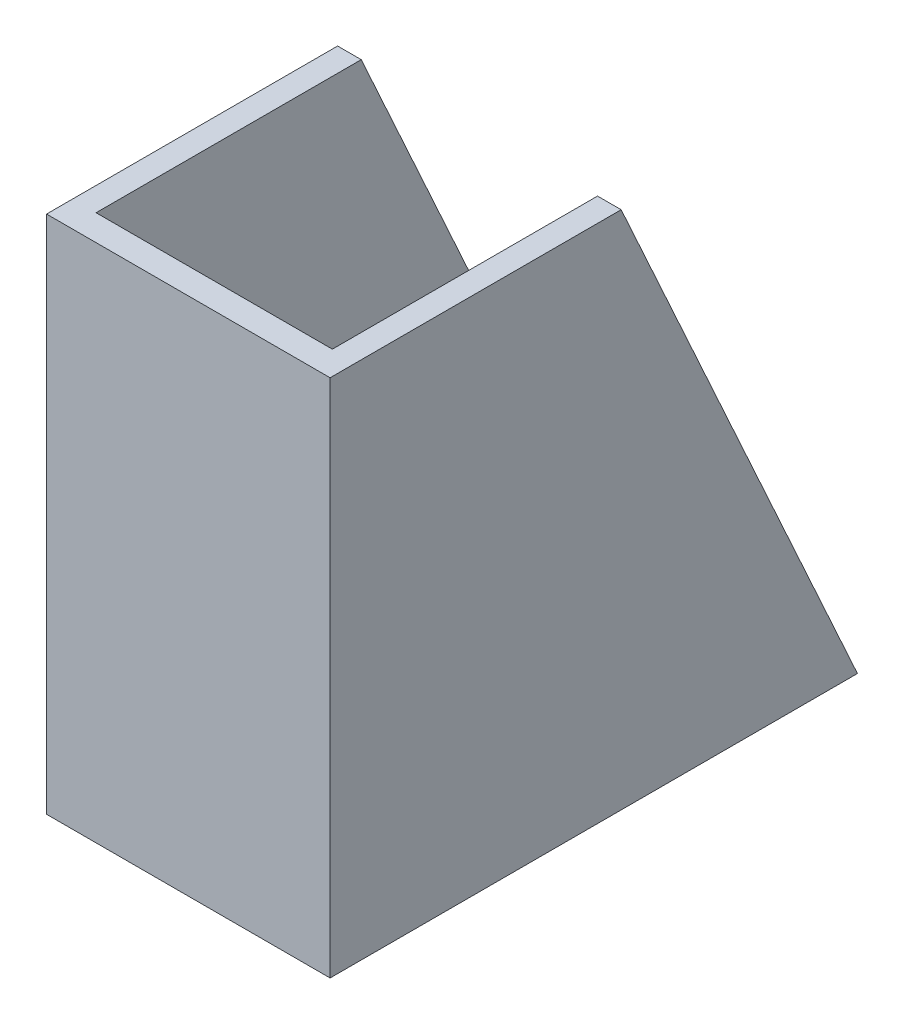
ISO-10303-21;
HEADER;
FILE_DESCRIPTION(('STEP AP214'),'2;1');
FILE_NAME('part.step','',(''),(''),'','','');
FILE_SCHEMA(('AUTOMOTIVE_DESIGN { 1 0 10303 214 1 1 1 1 }'));
ENDSEC;
DATA;
#1=APPLICATION_CONTEXT('core data for automotive mechanical design processes');
#2=APPLICATION_PROTOCOL_DEFINITION('international standard','automotive_design',2000,#1);
#3=PRODUCT_CONTEXT('',#1,'mechanical');
#4=PRODUCT('Part','Part','',(#3));
#5=PRODUCT_RELATED_PRODUCT_CATEGORY('part','',(#4));
#6=PRODUCT_DEFINITION_FORMATION('','',#4);
#7=PRODUCT_DEFINITION_CONTEXT('part definition',#1,'design');
#8=PRODUCT_DEFINITION('design','',#6,#7);
#9=PRODUCT_DEFINITION_SHAPE('','',#8);
#10=(LENGTH_UNIT() NAMED_UNIT(*) SI_UNIT(.MILLI.,.METRE.));
#11=(NAMED_UNIT(*) PLANE_ANGLE_UNIT() SI_UNIT($,.RADIAN.));
#12=(NAMED_UNIT(*) SI_UNIT($,.STERADIAN.) SOLID_ANGLE_UNIT());
#13=UNCERTAINTY_MEASURE_WITH_UNIT(LENGTH_MEASURE(1.E-05),#10,'distance_accuracy_value','');
#14=(GEOMETRIC_REPRESENTATION_CONTEXT(3) GLOBAL_UNCERTAINTY_ASSIGNED_CONTEXT((#13)) GLOBAL_UNIT_ASSIGNED_CONTEXT((#10,
#11,#12)) REPRESENTATION_CONTEXT('',''));
#15=CARTESIAN_POINT('',(0.,0.,0.));
#16=DIRECTION('',(0.,0.,1.));
#17=DIRECTION('',(1.,0.,0.));
#18=AXIS2_PLACEMENT_3D('',#15,#16,#17);
#19=CARTESIAN_POINT('',(-60.,76.2699156300782,30.795));
#20=DIRECTION('',(0.,0.,1.));
#21=DIRECTION('',(0.,-1.,0.));
#22=AXIS2_PLACEMENT_3D('',#19,#20,#21);
#23=PLANE('',#22);
#24=DIRECTION('',(0.,-1.,0.));
#25=VECTOR('',#24,1.);
#26=CARTESIAN_POINT('',(0.,76.2699156300782,30.795));
#27=LINE('',#26,#25);
#28=CARTESIAN_POINT('',(0.,76.2699156300782,30.795));
#29=VERTEX_POINT('',#28);
#30=CARTESIAN_POINT('',(0.,-33.7300843699218,30.795));
#31=VERTEX_POINT('',#30);
#32=EDGE_CURVE('E164',#29,#31,#27,.T.);
#33=ORIENTED_EDGE('',*,*,#32,.F.);
#34=DIRECTION('',(1.,0.,0.));
#35=VECTOR('',#34,1.);
#36=CARTESIAN_POINT('',(-60.,76.2699156300782,30.795));
#37=LINE('',#36,#35);
#38=CARTESIAN_POINT('',(-60.,76.2699156300782,30.795));
#39=VERTEX_POINT('',#38);
#40=EDGE_CURVE('E11',#39,#29,#37,.T.);
#41=ORIENTED_EDGE('',*,*,#40,.F.);
#42=DIRECTION('',(0.,-1.,0.));
#43=VECTOR('',#42,1.);
#44=CARTESIAN_POINT('',(-60.,76.2699156300782,30.795));
#45=LINE('',#44,#43);
#46=CARTESIAN_POINT('',(-60.,-33.7300843699218,30.795));
#47=VERTEX_POINT('',#46);
#48=EDGE_CURVE('E178',#39,#47,#45,.T.);
#49=ORIENTED_EDGE('',*,*,#48,.T.);
#50=DIRECTION('',(1.,0.,0.));
#51=VECTOR('',#50,1.);
#52=CARTESIAN_POINT('',(-60.,-33.7300843699218,30.795));
#53=LINE('',#52,#51);
#54=EDGE_CURVE('E42',#47,#31,#53,.T.);
#55=ORIENTED_EDGE('',*,*,#54,.T.);
#56=EDGE_LOOP('',(#33,#41,#49,#55));
#57=FACE_BOUND('',#56,.T.);
#58=ADVANCED_FACE('F39',(#57),#23,.T.);
#59=CARTESIAN_POINT('',(-60.,76.2699156300782,-30.795));
#60=DIRECTION('',(0.,1.,0.));
#61=DIRECTION('',(0.,0.,1.));
#62=AXIS2_PLACEMENT_3D('',#59,#60,#61);
#63=PLANE('',#62);
#64=DIRECTION('',(0.,0.,1.));
#65=VECTOR('',#64,1.);
#66=CARTESIAN_POINT('',(-5.,76.2699156300782,-30.795));
#67=LINE('',#66,#65);
#68=CARTESIAN_POINT('',(-5.,76.2699156300782,-30.795));
#69=VERTEX_POINT('',#68);
#70=CARTESIAN_POINT('',(-5.,76.2699156300782,25.315));
#71=VERTEX_POINT('',#70);
#72=EDGE_CURVE('E210',#69,#71,#67,.T.);
#73=ORIENTED_EDGE('',*,*,#72,.T.);
#74=DIRECTION('',(-1.,0.,0.));
#75=VECTOR('',#74,1.);
#76=CARTESIAN_POINT('',(-5.,76.2699156300782,25.315));
#77=LINE('',#76,#75);
#78=CARTESIAN_POINT('',(-55.,76.2699156300782,25.315));
#79=VERTEX_POINT('',#78);
#80=EDGE_CURVE('E138',#71,#79,#77,.T.);
#81=ORIENTED_EDGE('',*,*,#80,.T.);
#82=DIRECTION('',(0.,0.,1.));
#83=VECTOR('',#82,1.);
#84=CARTESIAN_POINT('',(-55.,76.2699156300782,-30.795));
#85=LINE('',#84,#83);
#86=CARTESIAN_POINT('',(-55.,76.2699156300782,-30.795));
#87=VERTEX_POINT('',#86);
#88=EDGE_CURVE('E128',#87,#79,#85,.T.);
#89=ORIENTED_EDGE('',*,*,#88,.F.);
#90=DIRECTION('',(1.,0.,0.));
#91=VECTOR('',#90,1.);
#92=CARTESIAN_POINT('',(-60.,76.2699156300782,-30.795));
#93=LINE('',#92,#91);
#94=CARTESIAN_POINT('',(-60.,76.2699156300782,-30.795));
#95=VERTEX_POINT('',#94);
#96=EDGE_CURVE('E48',#95,#87,#93,.T.);
#97=ORIENTED_EDGE('',*,*,#96,.F.);
#98=DIRECTION('',(0.,0.,1.));
#99=VECTOR('',#98,1.);
#100=CARTESIAN_POINT('',(-60.,76.2699156300782,-30.795));
#101=LINE('',#100,#99);
#102=EDGE_CURVE('E156',#95,#39,#101,.T.);
#103=ORIENTED_EDGE('',*,*,#102,.T.);
#104=ORIENTED_EDGE('',*,*,#40,.T.);
#105=DIRECTION('',(0.,0.,1.));
#106=VECTOR('',#105,1.);
#107=CARTESIAN_POINT('',(0.,76.2699156300782,-30.795));
#108=LINE('',#107,#106);
#109=CARTESIAN_POINT('',(0.,76.2699156300782,-30.795));
#110=VERTEX_POINT('',#109);
#111=EDGE_CURVE('E175',#110,#29,#108,.T.);
#112=ORIENTED_EDGE('',*,*,#111,.F.);
#113=EDGE_CURVE('E148',#69,#110,#93,.T.);
#114=ORIENTED_EDGE('',*,*,#113,.F.);
#115=EDGE_LOOP('',(#73,#81,#89,#97,#103,#104,#112,#114));
#116=FACE_BOUND('',#115,.T.);
#117=ADVANCED_FACE('F136',(#116),#63,.T.);
#118=CARTESIAN_POINT('',(-60.,76.2699156300782,-30.795));
#119=DIRECTION('',(0.,0.413802944301184,-0.910366477462605));
#120=DIRECTION('',(0.,0.910366477462605,0.413802944301184));
#121=AXIS2_PLACEMENT_3D('',#118,#119,#120);
#122=PLANE('',#121);
#123=DIRECTION('',(0.,0.910366477462605,0.413802944301184));
#124=VECTOR('',#123,1.);
#125=CARTESIAN_POINT('',(-5.,-28.7300843699218,-78.5222727272727));
#126=LINE('',#125,#124);
#127=CARTESIAN_POINT('',(-5.,-28.7300843699218,-78.5222727272727));
#128=VERTEX_POINT('',#127);
#129=EDGE_CURVE('E213',#128,#69,#126,.T.);
#130=ORIENTED_EDGE('',*,*,#129,.T.);
#131=ORIENTED_EDGE('',*,*,#113,.T.);
#132=DIRECTION('',(0.,0.910366477462605,0.413802944301184));
#133=VECTOR('',#132,1.);
#134=CARTESIAN_POINT('',(0.,76.2699156300782,-30.795));
#135=LINE('',#134,#133);
#136=CARTESIAN_POINT('',(0.,-33.7300843699218,-80.795));
#137=VERTEX_POINT('',#136);
#138=EDGE_CURVE('E172',#137,#110,#135,.T.);
#139=ORIENTED_EDGE('',*,*,#138,.F.);
#140=DIRECTION('',(1.,0.,0.));
#141=VECTOR('',#140,1.);
#142=CARTESIAN_POINT('',(-60.,-33.7300843699218,-80.795));
#143=LINE('',#142,#141);
#144=CARTESIAN_POINT('',(-60.,-33.7300843699218,-80.795));
#145=VERTEX_POINT('',#144);
#146=EDGE_CURVE('E151',#145,#137,#143,.T.);
#147=ORIENTED_EDGE('',*,*,#146,.F.);
#148=DIRECTION('',(0.,0.910366477462605,0.413802944301184));
#149=VECTOR('',#148,1.);
#150=CARTESIAN_POINT('',(-60.,76.2699156300782,-30.795));
#151=LINE('',#150,#149);
#152=EDGE_CURVE('E145',#145,#95,#151,.T.);
#153=ORIENTED_EDGE('',*,*,#152,.T.);
#154=ORIENTED_EDGE('',*,*,#96,.T.);
#155=DIRECTION('',(0.,0.910366477462605,0.413802944301184));
#156=VECTOR('',#155,1.);
#157=CARTESIAN_POINT('',(-55.,-28.7300843699218,-78.5222727272727));
#158=LINE('',#157,#156);
#159=CARTESIAN_POINT('',(-55.,-28.7300843699218,-78.5222727272727));
#160=VERTEX_POINT('',#159);
#161=EDGE_CURVE('E124',#160,#87,#158,.T.);
#162=ORIENTED_EDGE('',*,*,#161,.F.);
#163=DIRECTION('',(-1.,0.,0.));
#164=VECTOR('',#163,1.);
#165=CARTESIAN_POINT('',(-5.,-28.7300843699218,-78.5222727272727));
#166=LINE('',#165,#164);
#167=EDGE_CURVE('E195',#128,#160,#166,.T.);
#168=ORIENTED_EDGE('',*,*,#167,.F.);
#169=EDGE_LOOP('',(#130,#131,#139,#147,#153,#154,#162,#168));
#170=FACE_BOUND('',#169,.T.);
#171=ADVANCED_FACE('F143',(#170),#122,.T.);
#172=CARTESIAN_POINT('',(-60.,-33.7300843699218,-80.795));
#173=DIRECTION('',(0.,-1.,0.));
#174=DIRECTION('',(0.,0.,-1.));
#175=AXIS2_PLACEMENT_3D('',#172,#173,#174);
#176=PLANE('',#175);
#177=DIRECTION('',(0.,0.,-1.));
#178=VECTOR('',#177,1.);
#179=CARTESIAN_POINT('',(0.,-33.7300843699218,-80.795));
#180=LINE('',#179,#178);
#181=EDGE_CURVE('E168',#31,#137,#180,.T.);
#182=ORIENTED_EDGE('',*,*,#181,.F.);
#183=ORIENTED_EDGE('',*,*,#54,.F.);
#184=DIRECTION('',(0.,0.,-1.));
#185=VECTOR('',#184,1.);
#186=CARTESIAN_POINT('',(-60.,-33.7300843699218,-80.795));
#187=LINE('',#186,#185);
#188=EDGE_CURVE('E160',#47,#145,#187,.T.);
#189=ORIENTED_EDGE('',*,*,#188,.T.);
#190=ORIENTED_EDGE('',*,*,#146,.T.);
#191=EDGE_LOOP('',(#182,#183,#189,#190));
#192=FACE_BOUND('',#191,.T.);
#193=ADVANCED_FACE('F261',(#192),#176,.T.);
#194=CARTESIAN_POINT('',(-60.,0.,0.));
#195=DIRECTION('',(-1.,0.,0.));
#196=DIRECTION('',(0.,0.,1.));
#197=AXIS2_PLACEMENT_3D('',#194,#195,#196);
#198=PLANE('',#197);
#199=ORIENTED_EDGE('',*,*,#48,.F.);
#200=ORIENTED_EDGE('',*,*,#102,.F.);
#201=ORIENTED_EDGE('',*,*,#152,.F.);
#202=ORIENTED_EDGE('',*,*,#188,.F.);
#203=EDGE_LOOP('',(#199,#200,#201,#202));
#204=FACE_BOUND('',#203,.T.);
#205=ADVANCED_FACE('F263',(#204),#198,.T.);
#206=CARTESIAN_POINT('',(0.,0.,0.));
#207=DIRECTION('',(-1.,0.,0.));
#208=DIRECTION('',(0.,0.,1.));
#209=AXIS2_PLACEMENT_3D('',#206,#207,#208);
#210=PLANE('',#209);
#211=ORIENTED_EDGE('',*,*,#32,.T.);
#212=ORIENTED_EDGE('',*,*,#181,.T.);
#213=ORIENTED_EDGE('',*,*,#138,.T.);
#214=ORIENTED_EDGE('',*,*,#111,.T.);
#215=EDGE_LOOP('',(#211,#212,#213,#214));
#216=FACE_BOUND('',#215,.T.);
#217=ADVANCED_FACE('F260',(#216),#210,.F.);
#218=CARTESIAN_POINT('',(-5.,76.2699156300782,25.315));
#219=DIRECTION('',(0.,0.,-1.));
#220=DIRECTION('',(-1.,0.,0.));
#221=AXIS2_PLACEMENT_3D('',#218,#219,#220);
#222=PLANE('',#221);
#223=ORIENTED_EDGE('',*,*,#80,.F.);
#224=DIRECTION('',(0.,-1.,0.));
#225=VECTOR('',#224,1.);
#226=CARTESIAN_POINT('',(-5.,76.2699156300782,25.315));
#227=LINE('',#226,#225);
#228=CARTESIAN_POINT('',(-5.,71.2699156300782,25.315));
#229=VERTEX_POINT('',#228);
#230=EDGE_CURVE('E207',#71,#229,#227,.T.);
#231=ORIENTED_EDGE('',*,*,#230,.T.);
#232=DIRECTION('',(-1.,0.,0.));
#233=VECTOR('',#232,1.);
#234=CARTESIAN_POINT('',(-5.,71.2699156300782,25.315));
#235=LINE('',#234,#233);
#236=CARTESIAN_POINT('',(-55.,71.2699156300782,25.315));
#237=VERTEX_POINT('',#236);
#238=EDGE_CURVE('E186',#229,#237,#235,.T.);
#239=ORIENTED_EDGE('',*,*,#238,.T.);
#240=DIRECTION('',(0.,-1.,0.));
#241=VECTOR('',#240,1.);
#242=CARTESIAN_POINT('',(-55.,76.2699156300782,25.315));
#243=LINE('',#242,#241);
#244=EDGE_CURVE('E140',#79,#237,#243,.T.);
#245=ORIENTED_EDGE('',*,*,#244,.F.);
#246=EDGE_LOOP('',(#223,#231,#239,#245));
#247=FACE_BOUND('',#246,.T.);
#248=ADVANCED_FACE('F228',(#247),#222,.T.);
#249=CARTESIAN_POINT('',(-5.,71.2699156300782,25.315));
#250=DIRECTION('',(0.,-1.,0.));
#251=DIRECTION('',(0.,0.,-1.));
#252=AXIS2_PLACEMENT_3D('',#249,#250,#251);
#253=PLANE('',#252);
#254=ORIENTED_EDGE('',*,*,#238,.F.);
#255=DIRECTION('',(0.,0.,1.));
#256=VECTOR('',#255,1.);
#257=CARTESIAN_POINT('',(-5.,71.2699156300782,25.315));
#258=LINE('',#257,#256);
#259=CARTESIAN_POINT('',(-5.,71.2699156300782,25.795));
#260=VERTEX_POINT('',#259);
#261=EDGE_CURVE('E204',#229,#260,#258,.T.);
#262=ORIENTED_EDGE('',*,*,#261,.T.);
#263=DIRECTION('',(-1.,0.,0.));
#264=VECTOR('',#263,1.);
#265=CARTESIAN_POINT('',(-5.,71.2699156300782,25.795));
#266=LINE('',#265,#264);
#267=CARTESIAN_POINT('',(-55.,71.2699156300782,25.795));
#268=VERTEX_POINT('',#267);
#269=EDGE_CURVE('E189',#260,#268,#266,.T.);
#270=ORIENTED_EDGE('',*,*,#269,.T.);
#271=DIRECTION('',(0.,0.,1.));
#272=VECTOR('',#271,1.);
#273=CARTESIAN_POINT('',(-55.,71.2699156300782,25.315));
#274=LINE('',#273,#272);
#275=EDGE_CURVE('E221',#237,#268,#274,.T.);
#276=ORIENTED_EDGE('',*,*,#275,.F.);
#277=EDGE_LOOP('',(#254,#262,#270,#276));
#278=FACE_BOUND('',#277,.T.);
#279=ADVANCED_FACE('F233',(#278),#253,.T.);
#280=CARTESIAN_POINT('',(-5.,71.2699156300782,25.795));
#281=DIRECTION('',(0.,0.,-1.));
#282=DIRECTION('',(-1.,0.,0.));
#283=AXIS2_PLACEMENT_3D('',#280,#281,#282);
#284=PLANE('',#283);
#285=ORIENTED_EDGE('',*,*,#269,.F.);
#286=DIRECTION('',(0.,-1.,0.));
#287=VECTOR('',#286,1.);
#288=CARTESIAN_POINT('',(-5.,71.2699156300782,25.795));
#289=LINE('',#288,#287);
#290=CARTESIAN_POINT('',(-5.,-28.7300843699218,25.795));
#291=VERTEX_POINT('',#290);
#292=EDGE_CURVE('E201',#260,#291,#289,.T.);
#293=ORIENTED_EDGE('',*,*,#292,.T.);
#294=DIRECTION('',(-1.,0.,0.));
#295=VECTOR('',#294,1.);
#296=CARTESIAN_POINT('',(-5.,-28.7300843699218,25.795));
#297=LINE('',#296,#295);
#298=CARTESIAN_POINT('',(-55.,-28.7300843699218,25.795));
#299=VERTEX_POINT('',#298);
#300=EDGE_CURVE('E192',#291,#299,#297,.T.);
#301=ORIENTED_EDGE('',*,*,#300,.T.);
#302=DIRECTION('',(0.,-1.,0.));
#303=VECTOR('',#302,1.);
#304=CARTESIAN_POINT('',(-55.,71.2699156300782,25.795));
#305=LINE('',#304,#303);
#306=EDGE_CURVE('E218',#268,#299,#305,.T.);
#307=ORIENTED_EDGE('',*,*,#306,.F.);
#308=EDGE_LOOP('',(#285,#293,#301,#307));
#309=FACE_BOUND('',#308,.T.);
#310=ADVANCED_FACE('F238',(#309),#284,.T.);
#311=CARTESIAN_POINT('',(-5.,-28.7300843699218,25.795));
#312=DIRECTION('',(0.,1.,0.));
#313=DIRECTION('',(0.,0.,1.));
#314=AXIS2_PLACEMENT_3D('',#311,#312,#313);
#315=PLANE('',#314);
#316=ORIENTED_EDGE('',*,*,#300,.F.);
#317=DIRECTION('',(0.,0.,-1.));
#318=VECTOR('',#317,1.);
#319=CARTESIAN_POINT('',(-5.,-28.7300843699218,25.795));
#320=LINE('',#319,#318);
#321=EDGE_CURVE('E198',#291,#128,#320,.T.);
#322=ORIENTED_EDGE('',*,*,#321,.T.);
#323=ORIENTED_EDGE('',*,*,#167,.T.);
#324=DIRECTION('',(0.,0.,-1.));
#325=VECTOR('',#324,1.);
#326=CARTESIAN_POINT('',(-55.,-28.7300843699218,25.795));
#327=LINE('',#326,#325);
#328=EDGE_CURVE('E56',#299,#160,#327,.T.);
#329=ORIENTED_EDGE('',*,*,#328,.F.);
#330=EDGE_LOOP('',(#316,#322,#323,#329));
#331=FACE_BOUND('',#330,.T.);
#332=ADVANCED_FACE('F241',(#331),#315,.T.);
#333=CARTESIAN_POINT('',(-5.,0.,0.));
#334=DIRECTION('',(1.,0.,0.));
#335=DIRECTION('',(0.,0.,-1.));
#336=AXIS2_PLACEMENT_3D('',#333,#334,#335);
#337=PLANE('',#336);
#338=ORIENTED_EDGE('',*,*,#129,.F.);
#339=ORIENTED_EDGE('',*,*,#321,.F.);
#340=ORIENTED_EDGE('',*,*,#292,.F.);
#341=ORIENTED_EDGE('',*,*,#261,.F.);
#342=ORIENTED_EDGE('',*,*,#230,.F.);
#343=ORIENTED_EDGE('',*,*,#72,.F.);
#344=EDGE_LOOP('',(#338,#339,#340,#341,#342,#343));
#345=FACE_BOUND('',#344,.T.);
#346=ADVANCED_FACE('F246',(#345),#337,.F.);
#347=CARTESIAN_POINT('',(-55.,0.,0.));
#348=DIRECTION('',(1.,0.,0.));
#349=DIRECTION('',(0.,0.,-1.));
#350=AXIS2_PLACEMENT_3D('',#347,#348,#349);
#351=PLANE('',#350);
#352=ORIENTED_EDGE('',*,*,#161,.T.);
#353=ORIENTED_EDGE('',*,*,#88,.T.);
#354=ORIENTED_EDGE('',*,*,#244,.T.);
#355=ORIENTED_EDGE('',*,*,#275,.T.);
#356=ORIENTED_EDGE('',*,*,#306,.T.);
#357=ORIENTED_EDGE('',*,*,#328,.T.);
#358=EDGE_LOOP('',(#352,#353,#354,#355,#356,#357));
#359=FACE_BOUND('',#358,.T.);
#360=ADVANCED_FACE('F126',(#359),#351,.T.);
#361=CLOSED_SHELL('',(#58,#117,#171,#193,#205,#217,#248,#279,#310,#332,#346,#360));
#362=MANIFOLD_SOLID_BREP('B2',#361);
#363=ADVANCED_BREP_SHAPE_REPRESENTATION('',(#18,#362),#14);
#364=SHAPE_DEFINITION_REPRESENTATION(#9,#363);
ENDSEC;
END-ISO-10303-21;
